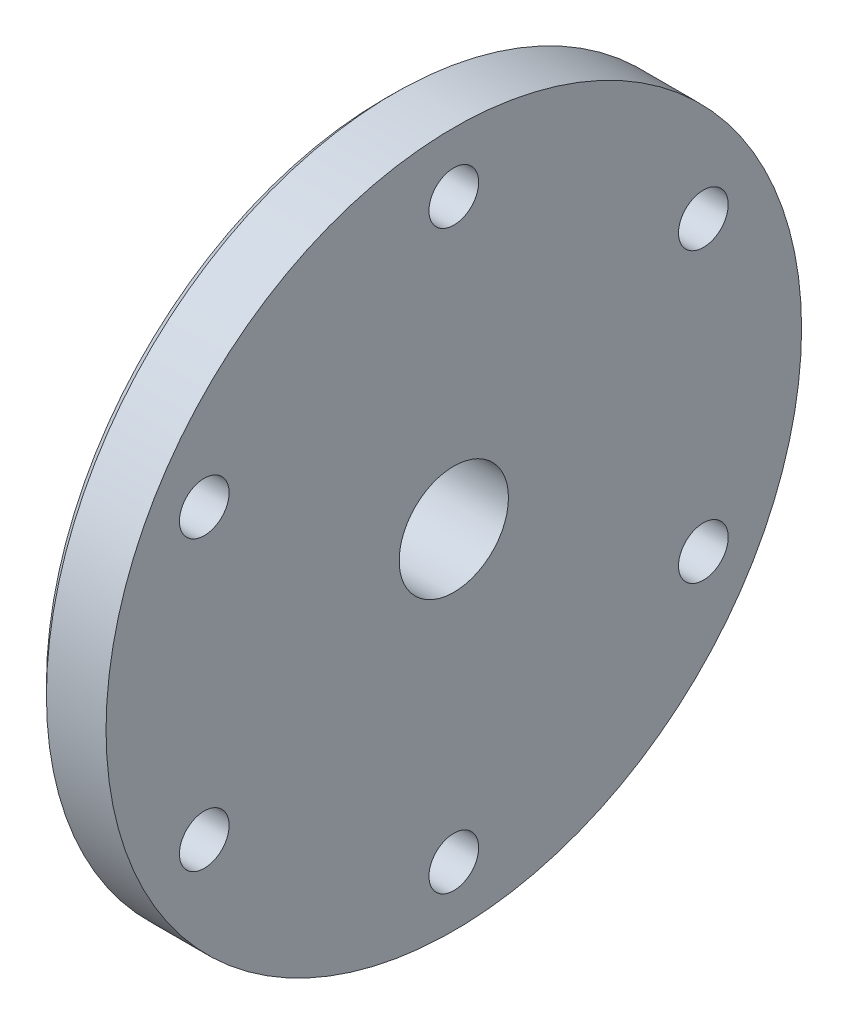
ISO-10303-21;
HEADER;
FILE_DESCRIPTION(('STEP AP214'),'2;1');
FILE_NAME('part.step','',(''),(''),'','','');
FILE_SCHEMA(('AUTOMOTIVE_DESIGN { 1 0 10303 214 1 1 1 1 }'));
ENDSEC;
DATA;
#1=APPLICATION_CONTEXT('core data for automotive mechanical design processes');
#2=APPLICATION_PROTOCOL_DEFINITION('international standard','automotive_design',2000,#1);
#3=PRODUCT_CONTEXT('',#1,'mechanical');
#4=PRODUCT('Part','Part','',(#3));
#5=PRODUCT_RELATED_PRODUCT_CATEGORY('part','',(#4));
#6=PRODUCT_DEFINITION_FORMATION('','',#4);
#7=PRODUCT_DEFINITION_CONTEXT('part definition',#1,'design');
#8=PRODUCT_DEFINITION('design','',#6,#7);
#9=PRODUCT_DEFINITION_SHAPE('','',#8);
#10=(LENGTH_UNIT() NAMED_UNIT(*) SI_UNIT(.MILLI.,.METRE.));
#11=(NAMED_UNIT(*) PLANE_ANGLE_UNIT() SI_UNIT($,.RADIAN.));
#12=(NAMED_UNIT(*) SI_UNIT($,.STERADIAN.) SOLID_ANGLE_UNIT());
#13=UNCERTAINTY_MEASURE_WITH_UNIT(LENGTH_MEASURE(1.E-05),#10,'distance_accuracy_value','');
#14=(GEOMETRIC_REPRESENTATION_CONTEXT(3) GLOBAL_UNCERTAINTY_ASSIGNED_CONTEXT((#13)) GLOBAL_UNIT_ASSIGNED_CONTEXT((#10,
#11,#12)) REPRESENTATION_CONTEXT('',''));
#15=CARTESIAN_POINT('',(0.,0.,0.));
#16=DIRECTION('',(0.,0.,1.));
#17=DIRECTION('',(1.,0.,0.));
#18=AXIS2_PLACEMENT_3D('',#15,#16,#17);
#19=CARTESIAN_POINT('',(-12.,0.,0.));
#20=DIRECTION('',(1.,0.,0.));
#21=DIRECTION('',(0.,0.,-1.));
#22=AXIS2_PLACEMENT_3D('',#19,#20,#21);
#23=PLANE('',#22);
#24=CARTESIAN_POINT('',(-12.,0.,0.));
#25=DIRECTION('',(1.,0.,0.));
#26=DIRECTION('',(0.,0.,-1.));
#27=AXIS2_PLACEMENT_3D('',#24,#25,#26);
#28=CIRCLE('',#27,10.);
#29=CARTESIAN_POINT('',(-12.,0.,-10.));
#30=VERTEX_POINT('',#29);
#31=EDGE_CURVE('E68',#30,#30,#28,.T.);
#32=ORIENTED_EDGE('',*,*,#31,.F.);
#33=EDGE_LOOP('',(#32));
#34=FACE_BOUND('',#33,.T.);
#35=ADVANCED_FACE('F47',(#34),#23,.F.);
#36=CARTESIAN_POINT('',(-12.,0.,0.));
#37=DIRECTION('',(1.,0.,0.));
#38=DIRECTION('',(0.,0.,-1.));
#39=AXIS2_PLACEMENT_3D('',#36,#37,#38);
#40=CONICAL_SURFACE('',#39,10.,1.22777238637419);
#41=CARTESIAN_POINT('',(-7.05825808840516,0.,0.));
#42=DIRECTION('',(1.,0.,0.));
#43=DIRECTION('',(0.,0.,-1.));
#44=AXIS2_PLACEMENT_3D('',#41,#42,#43);
#45=CIRCLE('',#44,23.8368773524655);
#46=CARTESIAN_POINT('',(-7.05825808840516,0.,-23.8368773524655));
#47=VERTEX_POINT('',#46);
#48=EDGE_CURVE('E59',#47,#47,#45,.F.);
#49=ORIENTED_EDGE('',*,*,#48,.T.);
#50=EDGE_LOOP('',(#49));
#51=FACE_BOUND('',#50,.T.);
#52=ORIENTED_EDGE('',*,*,#31,.T.);
#53=EDGE_LOOP('',(#52));
#54=FACE_BOUND('',#53,.T.);
#55=ADVANCED_FACE('F153',(#51,#54),#40,.T.);
#56=CARTESIAN_POINT('',(-7.,0.,0.));
#57=DIRECTION('',(1.,0.,0.));
#58=DIRECTION('',(0.,0.,-1.));
#59=AXIS2_PLACEMENT_3D('',#56,#57,#58);
#60=PLANE('',#59);
#61=CARTESIAN_POINT('',(-7.,0.,0.));
#62=DIRECTION('',(1.,0.,0.));
#63=DIRECTION('',(0.,0.,-1.));
#64=AXIS2_PLACEMENT_3D('',#61,#62,#63);
#65=CIRCLE('',#64,34.);
#66=CARTESIAN_POINT('',(-7.,0.,-34.));
#67=VERTEX_POINT('',#66);
#68=EDGE_CURVE('E11',#67,#67,#65,.F.);
#69=ORIENTED_EDGE('',*,*,#68,.T.);
#70=EDGE_LOOP('',(#69));
#71=FACE_BOUND('',#70,.T.);
#72=CARTESIAN_POINT('',(-7.,0.,0.));
#73=DIRECTION('',(1.,0.,0.));
#74=DIRECTION('',(0.,0.,-1.));
#75=AXIS2_PLACEMENT_3D('',#72,#73,#74);
#76=CIRCLE('',#75,24.1732137494637);
#77=CARTESIAN_POINT('',(-7.,0.,-24.1732137494637));
#78=VERTEX_POINT('',#77);
#79=EDGE_CURVE('E63',#78,#78,#76,.T.);
#80=ORIENTED_EDGE('',*,*,#79,.T.);
#81=EDGE_LOOP('',(#80));
#82=FACE_BOUND('',#81,.T.);
#83=CARTESIAN_POINT('',(-7.,29.,0.));
#84=DIRECTION('',(-1.,0.,0.));
#85=DIRECTION('',(0.,0.,1.));
#86=AXIS2_PLACEMENT_3D('',#83,#84,#85);
#87=CIRCLE('',#86,2.5);
#88=CARTESIAN_POINT('',(-7.,29.,2.5));
#89=VERTEX_POINT('',#88);
#90=EDGE_CURVE('E100',#89,#89,#87,.T.);
#91=ORIENTED_EDGE('',*,*,#90,.F.);
#92=EDGE_LOOP('',(#91));
#93=FACE_BOUND('',#92,.T.);
#94=CARTESIAN_POINT('',(-7.,14.5,-25.1147367097487));
#95=DIRECTION('',(-1.,0.,0.));
#96=DIRECTION('',(0.,0.,1.));
#97=AXIS2_PLACEMENT_3D('',#94,#95,#96);
#98=CIRCLE('',#97,2.5);
#99=CARTESIAN_POINT('',(-7.,14.5,-22.6147367097487));
#100=VERTEX_POINT('',#99);
#101=EDGE_CURVE('E79',#100,#100,#98,.T.);
#102=ORIENTED_EDGE('',*,*,#101,.F.);
#103=EDGE_LOOP('',(#102));
#104=FACE_BOUND('',#103,.T.);
#105=CARTESIAN_POINT('',(-7.,-14.4999999999999,-25.1147367097488));
#106=DIRECTION('',(-1.,0.,0.));
#107=DIRECTION('',(0.,0.,1.));
#108=AXIS2_PLACEMENT_3D('',#105,#106,#107);
#109=CIRCLE('',#108,2.5);
#110=CARTESIAN_POINT('',(-7.,-14.4999999999999,-22.6147367097488));
#111=VERTEX_POINT('',#110);
#112=EDGE_CURVE('E78',#111,#111,#109,.T.);
#113=ORIENTED_EDGE('',*,*,#112,.F.);
#114=EDGE_LOOP('',(#113));
#115=FACE_BOUND('',#114,.T.);
#116=CARTESIAN_POINT('',(-7.,-29.,0.));
#117=DIRECTION('',(-1.,0.,0.));
#118=DIRECTION('',(0.,0.,1.));
#119=AXIS2_PLACEMENT_3D('',#116,#117,#118);
#120=CIRCLE('',#119,2.5);
#121=CARTESIAN_POINT('',(-7.,-29.,2.5));
#122=VERTEX_POINT('',#121);
#123=EDGE_CURVE('E85',#122,#122,#120,.T.);
#124=ORIENTED_EDGE('',*,*,#123,.F.);
#125=EDGE_LOOP('',(#124));
#126=FACE_BOUND('',#125,.T.);
#127=CARTESIAN_POINT('',(-7.,-14.5,25.1147367097487));
#128=DIRECTION('',(-1.,0.,0.));
#129=DIRECTION('',(0.,0.,1.));
#130=AXIS2_PLACEMENT_3D('',#127,#128,#129);
#131=CIRCLE('',#130,2.5);
#132=CARTESIAN_POINT('',(-7.,-14.5,27.6147367097487));
#133=VERTEX_POINT('',#132);
#134=EDGE_CURVE('E91',#133,#133,#131,.T.);
#135=ORIENTED_EDGE('',*,*,#134,.F.);
#136=EDGE_LOOP('',(#135));
#137=FACE_BOUND('',#136,.T.);
#138=CARTESIAN_POINT('',(-7.,14.4999999999999,25.1147367097488));
#139=DIRECTION('',(-1.,0.,0.));
#140=DIRECTION('',(0.,0.,1.));
#141=AXIS2_PLACEMENT_3D('',#138,#139,#140);
#142=CIRCLE('',#141,2.5);
#143=CARTESIAN_POINT('',(-7.,14.4999999999999,27.6147367097488));
#144=VERTEX_POINT('',#143);
#145=EDGE_CURVE('E97',#144,#144,#142,.T.);
#146=ORIENTED_EDGE('',*,*,#145,.F.);
#147=EDGE_LOOP('',(#146));
#148=FACE_BOUND('',#147,.T.);
#149=ADVANCED_FACE('F147',(#71,#82,#93,#104,#115,#126,#137,#148),#60,.F.);
#150=CARTESIAN_POINT('',(0.,0.,0.));
#151=DIRECTION('',(1.,0.,0.));
#152=DIRECTION('',(0.,0.,-1.));
#153=AXIS2_PLACEMENT_3D('',#150,#151,#152);
#154=CYLINDRICAL_SURFACE('',#153,35.);
#155=CARTESIAN_POINT('',(-6.,0.,0.));
#156=DIRECTION('',(1.,0.,0.));
#157=DIRECTION('',(0.,0.,-1.));
#158=AXIS2_PLACEMENT_3D('',#155,#156,#157);
#159=CIRCLE('',#158,35.);
#160=CARTESIAN_POINT('',(-6.,0.,-35.));
#161=VERTEX_POINT('',#160);
#162=EDGE_CURVE('E55',#161,#161,#159,.T.);
#163=ORIENTED_EDGE('',*,*,#162,.T.);
#164=EDGE_LOOP('',(#163));
#165=FACE_BOUND('',#164,.T.);
#166=CARTESIAN_POINT('',(0.,0.,0.));
#167=DIRECTION('',(1.,0.,0.));
#168=DIRECTION('',(0.,0.,-1.));
#169=AXIS2_PLACEMENT_3D('',#166,#167,#168);
#170=CIRCLE('',#169,35.);
#171=CARTESIAN_POINT('',(0.,0.,-35.));
#172=VERTEX_POINT('',#171);
#173=EDGE_CURVE('E71',#172,#172,#170,.T.);
#174=ORIENTED_EDGE('',*,*,#173,.F.);
#175=EDGE_LOOP('',(#174));
#176=FACE_BOUND('',#175,.T.);
#177=ADVANCED_FACE('F130',(#165,#176),#154,.T.);
#178=CARTESIAN_POINT('',(0.,0.,0.));
#179=DIRECTION('',(1.,0.,0.));
#180=DIRECTION('',(0.,0.,-1.));
#181=AXIS2_PLACEMENT_3D('',#178,#179,#180);
#182=PLANE('',#181);
#183=CARTESIAN_POINT('',(0.,0.,0.));
#184=DIRECTION('',(1.,0.,0.));
#185=DIRECTION('',(0.,0.,-1.));
#186=AXIS2_PLACEMENT_3D('',#183,#184,#185);
#187=CIRCLE('',#186,5.5);
#188=CARTESIAN_POINT('',(0.,0.,-5.5));
#189=VERTEX_POINT('',#188);
#190=EDGE_CURVE('E111',#189,#189,#187,.T.);
#191=ORIENTED_EDGE('',*,*,#190,.F.);
#192=EDGE_LOOP('',(#191));
#193=FACE_BOUND('',#192,.T.);
#194=CARTESIAN_POINT('',(0.,29.,0.));
#195=DIRECTION('',(-1.,0.,0.));
#196=DIRECTION('',(0.,0.,1.));
#197=AXIS2_PLACEMENT_3D('',#194,#195,#196);
#198=CIRCLE('',#197,2.5);
#199=CARTESIAN_POINT('',(0.,29.,2.5));
#200=VERTEX_POINT('',#199);
#201=EDGE_CURVE('E74',#200,#200,#198,.T.);
#202=ORIENTED_EDGE('',*,*,#201,.T.);
#203=EDGE_LOOP('',(#202));
#204=FACE_BOUND('',#203,.T.);
#205=CARTESIAN_POINT('',(0.,14.5,-25.1147367097487));
#206=DIRECTION('',(-1.,0.,0.));
#207=DIRECTION('',(0.,0.,1.));
#208=AXIS2_PLACEMENT_3D('',#205,#206,#207);
#209=CIRCLE('',#208,2.5);
#210=CARTESIAN_POINT('',(0.,14.5,-22.6147367097487));
#211=VERTEX_POINT('',#210);
#212=EDGE_CURVE('E101',#211,#211,#209,.T.);
#213=ORIENTED_EDGE('',*,*,#212,.T.);
#214=EDGE_LOOP('',(#213));
#215=FACE_BOUND('',#214,.T.);
#216=CARTESIAN_POINT('',(0.,-14.4999999999999,-25.1147367097488));
#217=DIRECTION('',(-1.,0.,0.));
#218=DIRECTION('',(0.,0.,1.));
#219=AXIS2_PLACEMENT_3D('',#216,#217,#218);
#220=CIRCLE('',#219,2.5);
#221=CARTESIAN_POINT('',(0.,-14.4999999999999,-22.6147367097488));
#222=VERTEX_POINT('',#221);
#223=EDGE_CURVE('E75',#222,#222,#220,.T.);
#224=ORIENTED_EDGE('',*,*,#223,.T.);
#225=EDGE_LOOP('',(#224));
#226=FACE_BOUND('',#225,.T.);
#227=CARTESIAN_POINT('',(0.,-29.,0.));
#228=DIRECTION('',(-1.,0.,0.));
#229=DIRECTION('',(0.,0.,1.));
#230=AXIS2_PLACEMENT_3D('',#227,#228,#229);
#231=CIRCLE('',#230,2.5);
#232=CARTESIAN_POINT('',(0.,-29.,2.5));
#233=VERTEX_POINT('',#232);
#234=EDGE_CURVE('E82',#233,#233,#231,.T.);
#235=ORIENTED_EDGE('',*,*,#234,.T.);
#236=EDGE_LOOP('',(#235));
#237=FACE_BOUND('',#236,.T.);
#238=CARTESIAN_POINT('',(0.,-14.5,25.1147367097487));
#239=DIRECTION('',(-1.,0.,0.));
#240=DIRECTION('',(0.,0.,1.));
#241=AXIS2_PLACEMENT_3D('',#238,#239,#240);
#242=CIRCLE('',#241,2.5);
#243=CARTESIAN_POINT('',(0.,-14.5,27.6147367097487));
#244=VERTEX_POINT('',#243);
#245=EDGE_CURVE('E88',#244,#244,#242,.T.);
#246=ORIENTED_EDGE('',*,*,#245,.T.);
#247=EDGE_LOOP('',(#246));
#248=FACE_BOUND('',#247,.T.);
#249=CARTESIAN_POINT('',(0.,14.4999999999999,25.1147367097488));
#250=DIRECTION('',(-1.,0.,0.));
#251=DIRECTION('',(0.,0.,1.));
#252=AXIS2_PLACEMENT_3D('',#249,#250,#251);
#253=CIRCLE('',#252,2.5);
#254=CARTESIAN_POINT('',(0.,14.4999999999999,27.6147367097488));
#255=VERTEX_POINT('',#254);
#256=EDGE_CURVE('E94',#255,#255,#253,.T.);
#257=ORIENTED_EDGE('',*,*,#256,.T.);
#258=EDGE_LOOP('',(#257));
#259=FACE_BOUND('',#258,.T.);
#260=ORIENTED_EDGE('',*,*,#173,.T.);
#261=EDGE_LOOP('',(#260));
#262=FACE_BOUND('',#261,.T.);
#263=ADVANCED_FACE('F126',(#193,#204,#215,#226,#237,#248,#259,#262),#182,.T.);
#264=CARTESIAN_POINT('',(0.,14.4999999999999,25.1147367097488));
#265=DIRECTION('',(-1.,0.,0.));
#266=DIRECTION('',(0.,0.,1.));
#267=AXIS2_PLACEMENT_3D('',#264,#265,#266);
#268=CYLINDRICAL_SURFACE('',#267,2.5);
#269=ORIENTED_EDGE('',*,*,#256,.F.);
#270=EDGE_LOOP('',(#269));
#271=FACE_BOUND('',#270,.T.);
#272=ORIENTED_EDGE('',*,*,#145,.T.);
#273=EDGE_LOOP('',(#272));
#274=FACE_BOUND('',#273,.T.);
#275=ADVANCED_FACE('F129',(#271,#274),#268,.F.);
#276=CARTESIAN_POINT('',(0.,-14.5,25.1147367097487));
#277=DIRECTION('',(-1.,0.,0.));
#278=DIRECTION('',(0.,0.,1.));
#279=AXIS2_PLACEMENT_3D('',#276,#277,#278);
#280=CYLINDRICAL_SURFACE('',#279,2.5);
#281=ORIENTED_EDGE('',*,*,#245,.F.);
#282=EDGE_LOOP('',(#281));
#283=FACE_BOUND('',#282,.T.);
#284=ORIENTED_EDGE('',*,*,#134,.T.);
#285=EDGE_LOOP('',(#284));
#286=FACE_BOUND('',#285,.T.);
#287=ADVANCED_FACE('F190',(#283,#286),#280,.F.);
#288=CARTESIAN_POINT('',(0.,-29.,0.));
#289=DIRECTION('',(-1.,0.,0.));
#290=DIRECTION('',(0.,0.,1.));
#291=AXIS2_PLACEMENT_3D('',#288,#289,#290);
#292=CYLINDRICAL_SURFACE('',#291,2.5);
#293=ORIENTED_EDGE('',*,*,#234,.F.);
#294=EDGE_LOOP('',(#293));
#295=FACE_BOUND('',#294,.T.);
#296=ORIENTED_EDGE('',*,*,#123,.T.);
#297=EDGE_LOOP('',(#296));
#298=FACE_BOUND('',#297,.T.);
#299=ADVANCED_FACE('F196',(#295,#298),#292,.F.);
#300=CARTESIAN_POINT('',(0.,-14.4999999999999,-25.1147367097488));
#301=DIRECTION('',(-1.,0.,0.));
#302=DIRECTION('',(0.,0.,1.));
#303=AXIS2_PLACEMENT_3D('',#300,#301,#302);
#304=CYLINDRICAL_SURFACE('',#303,2.5);
#305=ORIENTED_EDGE('',*,*,#223,.F.);
#306=EDGE_LOOP('',(#305));
#307=FACE_BOUND('',#306,.T.);
#308=ORIENTED_EDGE('',*,*,#112,.T.);
#309=EDGE_LOOP('',(#308));
#310=FACE_BOUND('',#309,.T.);
#311=ADVANCED_FACE('F205',(#307,#310),#304,.F.);
#312=CARTESIAN_POINT('',(0.,14.5,-25.1147367097487));
#313=DIRECTION('',(-1.,0.,0.));
#314=DIRECTION('',(0.,0.,1.));
#315=AXIS2_PLACEMENT_3D('',#312,#313,#314);
#316=CYLINDRICAL_SURFACE('',#315,2.5);
#317=ORIENTED_EDGE('',*,*,#212,.F.);
#318=EDGE_LOOP('',(#317));
#319=FACE_BOUND('',#318,.T.);
#320=ORIENTED_EDGE('',*,*,#101,.T.);
#321=EDGE_LOOP('',(#320));
#322=FACE_BOUND('',#321,.T.);
#323=ADVANCED_FACE('F200',(#319,#322),#316,.F.);
#324=CARTESIAN_POINT('',(0.,29.,0.));
#325=DIRECTION('',(-1.,0.,0.));
#326=DIRECTION('',(0.,0.,1.));
#327=AXIS2_PLACEMENT_3D('',#324,#325,#326);
#328=CYLINDRICAL_SURFACE('',#327,2.5);
#329=ORIENTED_EDGE('',*,*,#201,.F.);
#330=EDGE_LOOP('',(#329));
#331=FACE_BOUND('',#330,.T.);
#332=ORIENTED_EDGE('',*,*,#90,.T.);
#333=EDGE_LOOP('',(#332));
#334=FACE_BOUND('',#333,.T.);
#335=ADVANCED_FACE('F122',(#331,#334),#328,.F.);
#336=CARTESIAN_POINT('',(-8.,0.,0.));
#337=DIRECTION('',(1.,0.,0.));
#338=DIRECTION('',(0.,0.,-1.));
#339=AXIS2_PLACEMENT_3D('',#336,#337,#338);
#340=CYLINDRICAL_SURFACE('',#339,5.5);
#341=CARTESIAN_POINT('',(-8.,0.,0.));
#342=DIRECTION('',(1.,0.,0.));
#343=DIRECTION('',(0.,0.,-1.));
#344=AXIS2_PLACEMENT_3D('',#341,#342,#343);
#345=CIRCLE('',#344,5.5);
#346=CARTESIAN_POINT('',(-8.,0.,-5.5));
#347=VERTEX_POINT('',#346);
#348=EDGE_CURVE('E104',#347,#347,#345,.T.);
#349=ORIENTED_EDGE('',*,*,#348,.F.);
#350=EDGE_LOOP('',(#349));
#351=FACE_BOUND('',#350,.T.);
#352=ORIENTED_EDGE('',*,*,#190,.T.);
#353=EDGE_LOOP('',(#352));
#354=FACE_BOUND('',#353,.T.);
#355=ADVANCED_FACE('F119',(#351,#354),#340,.F.);
#356=CARTESIAN_POINT('',(-8.,0.,0.));
#357=DIRECTION('',(1.,0.,0.));
#358=DIRECTION('',(0.,0.,-1.));
#359=AXIS2_PLACEMENT_3D('',#356,#357,#358);
#360=PLANE('',#359);
#361=ORIENTED_EDGE('',*,*,#348,.T.);
#362=EDGE_LOOP('',(#361));
#363=FACE_BOUND('',#362,.T.);
#364=ADVANCED_FACE('F117',(#363),#360,.T.);
#365=CARTESIAN_POINT('',(-8.,0.,0.));
#366=DIRECTION('',(1.,0.,0.));
#367=DIRECTION('',(0.,0.,-1.));
#368=AXIS2_PLACEMENT_3D('',#365,#366,#367);
#369=TOROIDAL_SURFACE('',#368,24.1732137494637,1.);
#370=ORIENTED_EDGE('',*,*,#48,.F.);
#371=EDGE_LOOP('',(#370));
#372=FACE_BOUND('',#371,.T.);
#373=ORIENTED_EDGE('',*,*,#79,.F.);
#374=EDGE_LOOP('',(#373));
#375=FACE_BOUND('',#374,.T.);
#376=ADVANCED_FACE('F165',(#372,#375),#369,.F.);
#377=CARTESIAN_POINT('',(-6.,0.,0.));
#378=DIRECTION('',(1.,0.,0.));
#379=DIRECTION('',(0.,0.,-1.));
#380=AXIS2_PLACEMENT_3D('',#377,#378,#379);
#381=CONICAL_SURFACE('',#380,35.,0.785398163397455);
#382=ORIENTED_EDGE('',*,*,#68,.F.);
#383=EDGE_LOOP('',(#382));
#384=FACE_BOUND('',#383,.T.);
#385=ORIENTED_EDGE('',*,*,#162,.F.);
#386=EDGE_LOOP('',(#385));
#387=FACE_BOUND('',#386,.T.);
#388=ADVANCED_FACE('F50',(#384,#387),#381,.T.);
#389=CLOSED_SHELL('',(#35,#55,#149,#177,#263,#275,#287,#299,#311,#323,#335,#355,#364,#376,#388));
#390=MANIFOLD_SOLID_BREP('B2',#389);
#391=ADVANCED_BREP_SHAPE_REPRESENTATION('',(#18,#390),#14);
#392=SHAPE_DEFINITION_REPRESENTATION(#9,#391);
ENDSEC;
END-ISO-10303-21;
